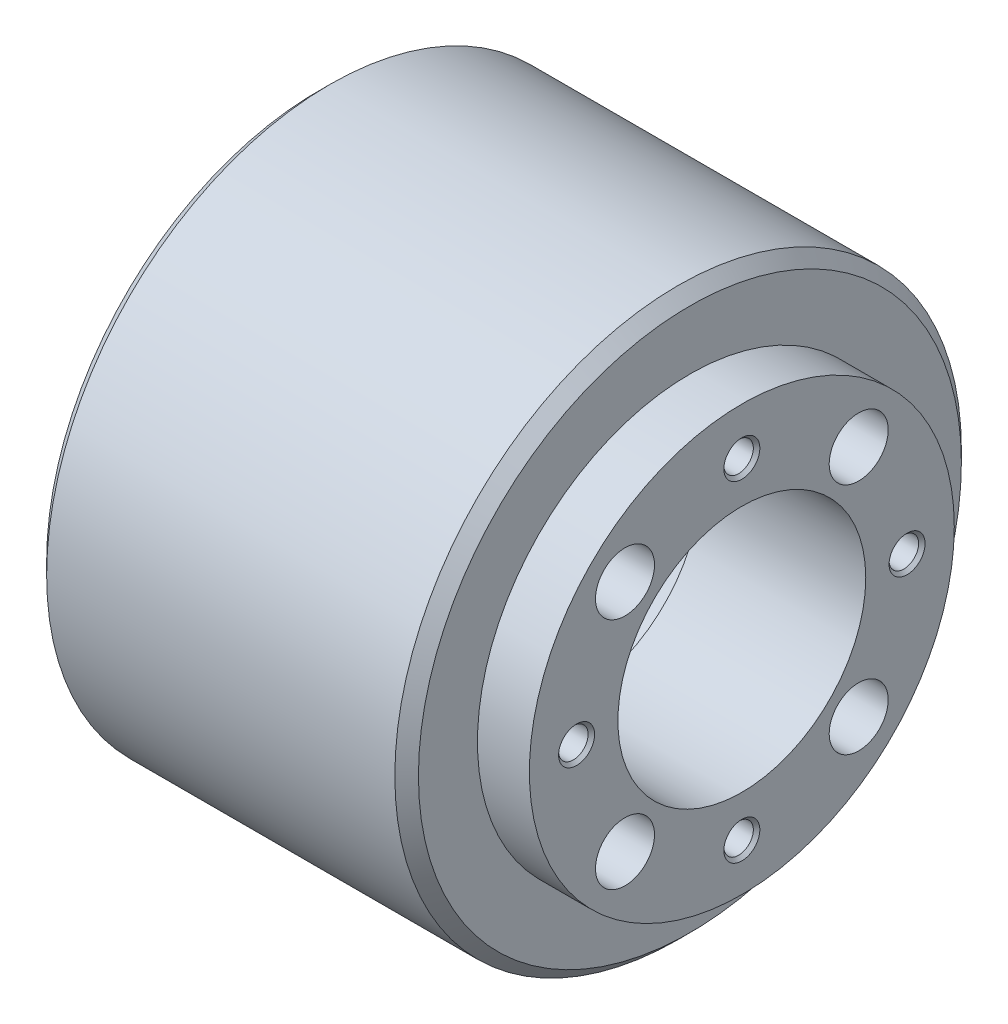
ISO-10303-21;
HEADER;
FILE_DESCRIPTION(('STEP AP214'),'2;1');
FILE_NAME('part.step','',(''),(''),'','','');
FILE_SCHEMA(('AUTOMOTIVE_DESIGN { 1 0 10303 214 1 1 1 1 }'));
ENDSEC;
DATA;
#1=APPLICATION_CONTEXT('core data for automotive mechanical design processes');
#2=APPLICATION_PROTOCOL_DEFINITION('international standard','automotive_design',2000,#1);
#3=PRODUCT_CONTEXT('',#1,'mechanical');
#4=PRODUCT('Part','Part','',(#3));
#5=PRODUCT_RELATED_PRODUCT_CATEGORY('part','',(#4));
#6=PRODUCT_DEFINITION_FORMATION('','',#4);
#7=PRODUCT_DEFINITION_CONTEXT('part definition',#1,'design');
#8=PRODUCT_DEFINITION('design','',#6,#7);
#9=PRODUCT_DEFINITION_SHAPE('','',#8);
#10=(LENGTH_UNIT() NAMED_UNIT(*) SI_UNIT(.MILLI.,.METRE.));
#11=(NAMED_UNIT(*) PLANE_ANGLE_UNIT() SI_UNIT($,.RADIAN.));
#12=(NAMED_UNIT(*) SI_UNIT($,.STERADIAN.) SOLID_ANGLE_UNIT());
#13=UNCERTAINTY_MEASURE_WITH_UNIT(LENGTH_MEASURE(1.E-05),#10,'distance_accuracy_value','');
#14=(GEOMETRIC_REPRESENTATION_CONTEXT(3) GLOBAL_UNCERTAINTY_ASSIGNED_CONTEXT((#13)) GLOBAL_UNIT_ASSIGNED_CONTEXT((#10,
#11,#12)) REPRESENTATION_CONTEXT('',''));
#15=CARTESIAN_POINT('',(0.,0.,0.));
#16=DIRECTION('',(0.,0.,1.));
#17=DIRECTION('',(1.,0.,0.));
#18=AXIS2_PLACEMENT_3D('',#15,#16,#17);
#19=CARTESIAN_POINT('',(0.,0.,19.5));
#20=DIRECTION('',(1.,0.,0.));
#21=DIRECTION('',(0.,0.,1.));
#22=AXIS2_PLACEMENT_3D('',#19,#20,#21);
#23=PLANE('',#22);
#24=CARTESIAN_POINT('',(0.,0.,0.));
#25=DIRECTION('',(-1.,0.,0.));
#26=DIRECTION('',(0.,0.,1.));
#27=AXIS2_PLACEMENT_3D('',#24,#25,#26);
#28=CIRCLE('',#27,20.5);
#29=CARTESIAN_POINT('',(0.,0.,20.5));
#30=VERTEX_POINT('',#29);
#31=EDGE_CURVE('E135',#30,#30,#28,.T.);
#32=ORIENTED_EDGE('',*,*,#31,.F.);
#33=EDGE_LOOP('',(#32));
#34=FACE_BOUND('',#33,.T.);
#35=CARTESIAN_POINT('',(0.,0.,0.));
#36=DIRECTION('',(-1.,0.,0.));
#37=DIRECTION('',(0.,0.,1.));
#38=AXIS2_PLACEMENT_3D('',#35,#36,#37);
#39=CIRCLE('',#38,23.);
#40=CARTESIAN_POINT('',(0.,0.,23.));
#41=VERTEX_POINT('',#40);
#42=EDGE_CURVE('E132',#41,#41,#39,.F.);
#43=ORIENTED_EDGE('',*,*,#42,.F.);
#44=EDGE_LOOP('',(#43));
#45=FACE_BOUND('',#44,.T.);
#46=ADVANCED_FACE('F37',(#34,#45),#23,.F.);
#47=CARTESIAN_POINT('',(0.,0.,0.));
#48=DIRECTION('',(-1.,0.,0.));
#49=DIRECTION('',(0.,0.,-1.));
#50=AXIS2_PLACEMENT_3D('',#47,#48,#49);
#51=CYLINDRICAL_SURFACE('',#50,24.);
#52=CARTESIAN_POINT('',(30.5,0.,0.));
#53=DIRECTION('',(1.,0.,0.));
#54=DIRECTION('',(0.,0.,-1.));
#55=AXIS2_PLACEMENT_3D('',#52,#53,#54);
#56=CIRCLE('',#55,24.);
#57=CARTESIAN_POINT('',(30.5,0.,-24.));
#58=VERTEX_POINT('',#57);
#59=EDGE_CURVE('E45',#58,#58,#56,.T.);
#60=ORIENTED_EDGE('',*,*,#59,.F.);
#61=EDGE_LOOP('',(#60));
#62=FACE_BOUND('',#61,.T.);
#63=CARTESIAN_POINT('',(0.99999999999999,0.,0.));
#64=DIRECTION('',(-1.,0.,0.));
#65=DIRECTION('',(0.,0.,1.));
#66=AXIS2_PLACEMENT_3D('',#63,#64,#65);
#67=CIRCLE('',#66,24.);
#68=CARTESIAN_POINT('',(0.99999999999999,0.,24.));
#69=VERTEX_POINT('',#68);
#70=EDGE_CURVE('E138',#69,#69,#67,.T.);
#71=ORIENTED_EDGE('',*,*,#70,.F.);
#72=EDGE_LOOP('',(#71));
#73=FACE_BOUND('',#72,.T.);
#74=ADVANCED_FACE('F145',(#62,#73),#51,.T.);
#75=CARTESIAN_POINT('',(31.5,0.,24.));
#76=DIRECTION('',(-1.,0.,0.));
#77=DIRECTION('',(0.,0.,-1.));
#78=AXIS2_PLACEMENT_3D('',#75,#76,#77);
#79=PLANE('',#78);
#80=CARTESIAN_POINT('',(31.5,0.,0.));
#81=DIRECTION('',(1.,0.,0.));
#82=DIRECTION('',(0.,0.,-1.));
#83=AXIS2_PLACEMENT_3D('',#80,#81,#82);
#84=CIRCLE('',#83,23.);
#85=CARTESIAN_POINT('',(31.5,0.,-23.));
#86=VERTEX_POINT('',#85);
#87=EDGE_CURVE('E11',#86,#86,#84,.F.);
#88=ORIENTED_EDGE('',*,*,#87,.F.);
#89=EDGE_LOOP('',(#88));
#90=FACE_BOUND('',#89,.T.);
#91=CARTESIAN_POINT('',(31.5,0.,0.));
#92=DIRECTION('',(1.,0.,0.));
#93=DIRECTION('',(0.,0.,-1.));
#94=AXIS2_PLACEMENT_3D('',#91,#92,#93);
#95=CIRCLE('',#94,18.);
#96=CARTESIAN_POINT('',(31.5,0.,-18.));
#97=VERTEX_POINT('',#96);
#98=EDGE_CURVE('E114',#97,#97,#95,.T.);
#99=ORIENTED_EDGE('',*,*,#98,.F.);
#100=EDGE_LOOP('',(#99));
#101=FACE_BOUND('',#100,.T.);
#102=ADVANCED_FACE('F148',(#90,#101),#79,.F.);
#103=CARTESIAN_POINT('',(0.,0.,0.));
#104=DIRECTION('',(-1.,0.,0.));
#105=DIRECTION('',(0.,0.,-1.));
#106=AXIS2_PLACEMENT_3D('',#103,#104,#105);
#107=CYLINDRICAL_SURFACE('',#106,18.);
#108=ORIENTED_EDGE('',*,*,#98,.T.);
#109=EDGE_LOOP('',(#108));
#110=FACE_BOUND('',#109,.T.);
#111=CARTESIAN_POINT('',(35.9,0.,0.));
#112=DIRECTION('',(1.,0.,0.));
#113=DIRECTION('',(0.,0.,-1.));
#114=AXIS2_PLACEMENT_3D('',#111,#112,#113);
#115=CIRCLE('',#114,18.);
#116=CARTESIAN_POINT('',(35.9,0.,-18.));
#117=VERTEX_POINT('',#116);
#118=EDGE_CURVE('E111',#117,#117,#115,.T.);
#119=ORIENTED_EDGE('',*,*,#118,.F.);
#120=EDGE_LOOP('',(#119));
#121=FACE_BOUND('',#120,.T.);
#122=ADVANCED_FACE('F185',(#110,#121),#107,.T.);
#123=CARTESIAN_POINT('',(35.9,0.,10.5));
#124=DIRECTION('',(-1.,0.,0.));
#125=DIRECTION('',(0.,0.,-1.));
#126=AXIS2_PLACEMENT_3D('',#123,#124,#125);
#127=PLANE('',#126);
#128=CARTESIAN_POINT('',(35.9,-9.89949493661167,9.89949493661166));
#129=DIRECTION('',(-1.,0.,0.));
#130=DIRECTION('',(0.,0.,-1.));
#131=AXIS2_PLACEMENT_3D('',#128,#129,#130);
#132=CIRCLE('',#131,2.5);
#133=CARTESIAN_POINT('',(35.9,-9.89949493661167,7.39949493661166));
#134=VERTEX_POINT('',#133);
#135=EDGE_CURVE('E302',#134,#134,#132,.T.);
#136=ORIENTED_EDGE('',*,*,#135,.T.);
#137=EDGE_LOOP('',(#136));
#138=FACE_BOUND('',#137,.T.);
#139=CARTESIAN_POINT('',(35.9,-9.89949493661167,-9.89949493661166));
#140=DIRECTION('',(-1.,0.,0.));
#141=DIRECTION('',(0.,0.,1.));
#142=AXIS2_PLACEMENT_3D('',#139,#140,#141);
#143=CIRCLE('',#142,2.5);
#144=CARTESIAN_POINT('',(35.9,-9.89949493661167,-7.39949493661166));
#145=VERTEX_POINT('',#144);
#146=EDGE_CURVE('E301',#145,#145,#143,.T.);
#147=ORIENTED_EDGE('',*,*,#146,.T.);
#148=EDGE_LOOP('',(#147));
#149=FACE_BOUND('',#148,.T.);
#150=CARTESIAN_POINT('',(35.9,9.89949493661167,9.89949493661167));
#151=DIRECTION('',(-1.,0.,0.));
#152=DIRECTION('',(0.,0.,-1.));
#153=AXIS2_PLACEMENT_3D('',#150,#151,#152);
#154=CIRCLE('',#153,2.5);
#155=CARTESIAN_POINT('',(35.9,9.89949493661167,7.39949493661166));
#156=VERTEX_POINT('',#155);
#157=EDGE_CURVE('E311',#156,#156,#154,.T.);
#158=ORIENTED_EDGE('',*,*,#157,.T.);
#159=EDGE_LOOP('',(#158));
#160=FACE_BOUND('',#159,.T.);
#161=CARTESIAN_POINT('',(35.9,9.89949493661167,-9.89949493661167));
#162=DIRECTION('',(-1.,0.,0.));
#163=DIRECTION('',(0.,0.,1.));
#164=AXIS2_PLACEMENT_3D('',#161,#162,#163);
#165=CIRCLE('',#164,2.5);
#166=CARTESIAN_POINT('',(35.9,9.89949493661167,-7.39949493661166));
#167=VERTEX_POINT('',#166);
#168=EDGE_CURVE('E316',#167,#167,#165,.T.);
#169=ORIENTED_EDGE('',*,*,#168,.T.);
#170=EDGE_LOOP('',(#169));
#171=FACE_BOUND('',#170,.T.);
#172=CARTESIAN_POINT('',(35.9,14.,0.));
#173=DIRECTION('',(-1.,0.,0.));
#174=DIRECTION('',(0.,0.,1.));
#175=AXIS2_PLACEMENT_3D('',#172,#173,#174);
#176=CIRCLE('',#175,1.525);
#177=CARTESIAN_POINT('',(35.9,14.,1.525));
#178=VERTEX_POINT('',#177);
#179=EDGE_CURVE('E75',#178,#178,#176,.T.);
#180=ORIENTED_EDGE('',*,*,#179,.T.);
#181=EDGE_LOOP('',(#180));
#182=FACE_BOUND('',#181,.T.);
#183=CARTESIAN_POINT('',(35.9,0.,14.));
#184=DIRECTION('',(-1.,0.,0.));
#185=DIRECTION('',(0.,0.,1.));
#186=AXIS2_PLACEMENT_3D('',#183,#184,#185);
#187=CIRCLE('',#186,1.525);
#188=CARTESIAN_POINT('',(35.9,0.,15.525));
#189=VERTEX_POINT('',#188);
#190=EDGE_CURVE('E68',#189,#189,#187,.T.);
#191=ORIENTED_EDGE('',*,*,#190,.T.);
#192=EDGE_LOOP('',(#191));
#193=FACE_BOUND('',#192,.T.);
#194=CARTESIAN_POINT('',(35.9,-14.,0.));
#195=DIRECTION('',(-1.,0.,0.));
#196=DIRECTION('',(0.,0.,1.));
#197=AXIS2_PLACEMENT_3D('',#194,#195,#196);
#198=CIRCLE('',#197,1.525);
#199=CARTESIAN_POINT('',(35.9,-14.,1.525));
#200=VERTEX_POINT('',#199);
#201=EDGE_CURVE('E84',#200,#200,#198,.T.);
#202=ORIENTED_EDGE('',*,*,#201,.T.);
#203=EDGE_LOOP('',(#202));
#204=FACE_BOUND('',#203,.T.);
#205=CARTESIAN_POINT('',(35.9,0.,-14.));
#206=DIRECTION('',(-1.,0.,0.));
#207=DIRECTION('',(0.,0.,1.));
#208=AXIS2_PLACEMENT_3D('',#205,#206,#207);
#209=CIRCLE('',#208,1.525);
#210=CARTESIAN_POINT('',(35.9,0.,-12.475));
#211=VERTEX_POINT('',#210);
#212=EDGE_CURVE('E93',#211,#211,#209,.T.);
#213=ORIENTED_EDGE('',*,*,#212,.T.);
#214=EDGE_LOOP('',(#213));
#215=FACE_BOUND('',#214,.T.);
#216=ORIENTED_EDGE('',*,*,#118,.T.);
#217=EDGE_LOOP('',(#216));
#218=FACE_BOUND('',#217,.T.);
#219=CARTESIAN_POINT('',(35.9,0.,0.));
#220=DIRECTION('',(1.,0.,0.));
#221=DIRECTION('',(0.,0.,-1.));
#222=AXIS2_PLACEMENT_3D('',#219,#220,#221);
#223=CIRCLE('',#222,10.5);
#224=CARTESIAN_POINT('',(35.9,0.,-10.5));
#225=VERTEX_POINT('',#224);
#226=EDGE_CURVE('E108',#225,#225,#223,.T.);
#227=ORIENTED_EDGE('',*,*,#226,.F.);
#228=EDGE_LOOP('',(#227));
#229=FACE_BOUND('',#228,.T.);
#230=ADVANCED_FACE('F190',(#138,#149,#160,#171,#182,#193,#204,#215,#218,#229),#127,.F.);
#231=CARTESIAN_POINT('',(0.,0.,0.));
#232=DIRECTION('',(-1.,0.,0.));
#233=DIRECTION('',(0.,0.,-1.));
#234=AXIS2_PLACEMENT_3D('',#231,#232,#233);
#235=CYLINDRICAL_SURFACE('',#234,10.5);
#236=ORIENTED_EDGE('',*,*,#226,.T.);
#237=EDGE_LOOP('',(#236));
#238=FACE_BOUND('',#237,.T.);
#239=CARTESIAN_POINT('',(21.9,0.,0.));
#240=DIRECTION('',(1.,0.,0.));
#241=DIRECTION('',(0.,0.,-1.));
#242=AXIS2_PLACEMENT_3D('',#239,#240,#241);
#243=CIRCLE('',#242,10.5);
#244=CARTESIAN_POINT('',(21.9,0.,-10.5));
#245=VERTEX_POINT('',#244);
#246=EDGE_CURVE('E105',#245,#245,#243,.T.);
#247=ORIENTED_EDGE('',*,*,#246,.F.);
#248=EDGE_LOOP('',(#247));
#249=FACE_BOUND('',#248,.T.);
#250=ADVANCED_FACE('F196',(#238,#249),#235,.F.);
#251=CARTESIAN_POINT('',(21.9,0.,15.));
#252=DIRECTION('',(1.,0.,0.));
#253=DIRECTION('',(0.,0.,1.));
#254=AXIS2_PLACEMENT_3D('',#251,#252,#253);
#255=PLANE('',#254);
#256=ORIENTED_EDGE('',*,*,#246,.T.);
#257=EDGE_LOOP('',(#256));
#258=FACE_BOUND('',#257,.T.);
#259=CARTESIAN_POINT('',(21.9,0.,0.));
#260=DIRECTION('',(1.,0.,0.));
#261=DIRECTION('',(0.,0.,-1.));
#262=AXIS2_PLACEMENT_3D('',#259,#260,#261);
#263=CIRCLE('',#262,15.);
#264=CARTESIAN_POINT('',(21.9,0.,-15.));
#265=VERTEX_POINT('',#264);
#266=EDGE_CURVE('E102',#265,#265,#263,.T.);
#267=ORIENTED_EDGE('',*,*,#266,.F.);
#268=EDGE_LOOP('',(#267));
#269=FACE_BOUND('',#268,.T.);
#270=ADVANCED_FACE('F203',(#258,#269),#255,.F.);
#271=CARTESIAN_POINT('',(0.,0.,0.));
#272=DIRECTION('',(-1.,0.,0.));
#273=DIRECTION('',(0.,0.,-1.));
#274=AXIS2_PLACEMENT_3D('',#271,#272,#273);
#275=CYLINDRICAL_SURFACE('',#274,15.);
#276=CARTESIAN_POINT('',(6.39999999999999,0.,0.));
#277=DIRECTION('',(-1.,0.,0.));
#278=DIRECTION('',(0.,0.,1.));
#279=AXIS2_PLACEMENT_3D('',#276,#277,#278);
#280=CIRCLE('',#279,15.);
#281=CARTESIAN_POINT('',(6.39999999999999,0.,15.));
#282=VERTEX_POINT('',#281);
#283=EDGE_CURVE('E129',#282,#282,#280,.F.);
#284=ORIENTED_EDGE('',*,*,#283,.F.);
#285=EDGE_LOOP('',(#284));
#286=FACE_BOUND('',#285,.T.);
#287=ORIENTED_EDGE('',*,*,#266,.T.);
#288=EDGE_LOOP('',(#287));
#289=FACE_BOUND('',#288,.T.);
#290=ADVANCED_FACE('F209',(#286,#289),#275,.F.);
#291=CARTESIAN_POINT('',(5.4,0.,15.));
#292=DIRECTION('',(1.,0.,0.));
#293=DIRECTION('',(0.,0.,1.));
#294=AXIS2_PLACEMENT_3D('',#291,#292,#293);
#295=PLANE('',#294);
#296=CARTESIAN_POINT('',(5.4,0.,0.));
#297=DIRECTION('',(-1.,0.,0.));
#298=DIRECTION('',(0.,0.,1.));
#299=AXIS2_PLACEMENT_3D('',#296,#297,#298);
#300=CIRCLE('',#299,18.5);
#301=CARTESIAN_POINT('',(5.4,0.,18.5));
#302=VERTEX_POINT('',#301);
#303=EDGE_CURVE('E120',#302,#302,#300,.F.);
#304=ORIENTED_EDGE('',*,*,#303,.F.);
#305=EDGE_LOOP('',(#304));
#306=FACE_BOUND('',#305,.T.);
#307=CARTESIAN_POINT('',(5.4,0.,0.));
#308=DIRECTION('',(-1.,0.,0.));
#309=DIRECTION('',(0.,0.,1.));
#310=AXIS2_PLACEMENT_3D('',#307,#308,#309);
#311=CIRCLE('',#310,16.);
#312=CARTESIAN_POINT('',(5.4,0.,16.));
#313=VERTEX_POINT('',#312);
#314=EDGE_CURVE('E117',#313,#313,#311,.T.);
#315=ORIENTED_EDGE('',*,*,#314,.F.);
#316=EDGE_LOOP('',(#315));
#317=FACE_BOUND('',#316,.T.);
#318=ADVANCED_FACE('F214',(#306,#317),#295,.F.);
#319=CARTESIAN_POINT('',(0.,0.,0.));
#320=DIRECTION('',(-1.,0.,0.));
#321=DIRECTION('',(0.,0.,-1.));
#322=AXIS2_PLACEMENT_3D('',#319,#320,#321);
#323=CYLINDRICAL_SURFACE('',#322,19.5);
#324=CARTESIAN_POINT('',(4.4,0.,0.));
#325=DIRECTION('',(-1.,0.,0.));
#326=DIRECTION('',(0.,0.,1.));
#327=AXIS2_PLACEMENT_3D('',#324,#325,#326);
#328=CIRCLE('',#327,19.5);
#329=CARTESIAN_POINT('',(4.4,0.,19.5));
#330=VERTEX_POINT('',#329);
#331=EDGE_CURVE('E126',#330,#330,#328,.T.);
#332=ORIENTED_EDGE('',*,*,#331,.F.);
#333=EDGE_LOOP('',(#332));
#334=FACE_BOUND('',#333,.T.);
#335=CARTESIAN_POINT('',(1.00000000000002,0.,0.));
#336=DIRECTION('',(-1.,0.,0.));
#337=DIRECTION('',(0.,0.,1.));
#338=AXIS2_PLACEMENT_3D('',#335,#336,#337);
#339=CIRCLE('',#338,19.5);
#340=CARTESIAN_POINT('',(1.00000000000002,0.,19.5));
#341=VERTEX_POINT('',#340);
#342=EDGE_CURVE('E123',#341,#341,#339,.F.);
#343=ORIENTED_EDGE('',*,*,#342,.F.);
#344=EDGE_LOOP('',(#343));
#345=FACE_BOUND('',#344,.T.);
#346=ADVANCED_FACE('F169',(#334,#345),#323,.F.);
#347=CARTESIAN_POINT('',(5.4,0.,0.));
#348=DIRECTION('',(-1.,0.,0.));
#349=DIRECTION('',(0.,0.,-1.));
#350=AXIS2_PLACEMENT_3D('',#347,#348,#349);
#351=CONICAL_SURFACE('',#350,18.5,0.785398163397454);
#352=ORIENTED_EDGE('',*,*,#331,.T.);
#353=EDGE_LOOP('',(#352));
#354=FACE_BOUND('',#353,.T.);
#355=ORIENTED_EDGE('',*,*,#303,.T.);
#356=EDGE_LOOP('',(#355));
#357=FACE_BOUND('',#356,.T.);
#358=ADVANCED_FACE('F165',(#354,#357),#351,.F.);
#359=CARTESIAN_POINT('',(6.39999999999999,0.,0.));
#360=DIRECTION('',(-1.,0.,0.));
#361=DIRECTION('',(0.,0.,-1.));
#362=AXIS2_PLACEMENT_3D('',#359,#360,#361);
#363=CONICAL_SURFACE('',#362,15.,0.785398163397453);
#364=ORIENTED_EDGE('',*,*,#314,.T.);
#365=EDGE_LOOP('',(#364));
#366=FACE_BOUND('',#365,.T.);
#367=ORIENTED_EDGE('',*,*,#283,.T.);
#368=EDGE_LOOP('',(#367));
#369=FACE_BOUND('',#368,.T.);
#370=ADVANCED_FACE('F168',(#366,#369),#363,.F.);
#371=CARTESIAN_POINT('',(1.00000000000002,0.,0.));
#372=DIRECTION('',(-1.,0.,0.));
#373=DIRECTION('',(0.,0.,-1.));
#374=AXIS2_PLACEMENT_3D('',#371,#372,#373);
#375=CONICAL_SURFACE('',#374,19.5,0.785398163397447);
#376=ORIENTED_EDGE('',*,*,#31,.T.);
#377=EDGE_LOOP('',(#376));
#378=FACE_BOUND('',#377,.T.);
#379=ORIENTED_EDGE('',*,*,#342,.T.);
#380=EDGE_LOOP('',(#379));
#381=FACE_BOUND('',#380,.T.);
#382=ADVANCED_FACE('F173',(#378,#381),#375,.F.);
#383=CARTESIAN_POINT('',(30.5,0.,0.));
#384=DIRECTION('',(-1.,0.,0.));
#385=DIRECTION('',(0.,0.,-1.));
#386=AXIS2_PLACEMENT_3D('',#383,#384,#385);
#387=CONICAL_SURFACE('',#386,24.,0.785398163397453);
#388=ORIENTED_EDGE('',*,*,#87,.T.);
#389=EDGE_LOOP('',(#388));
#390=FACE_BOUND('',#389,.T.);
#391=ORIENTED_EDGE('',*,*,#59,.T.);
#392=EDGE_LOOP('',(#391));
#393=FACE_BOUND('',#392,.T.);
#394=ADVANCED_FACE('F143',(#390,#393),#387,.T.);
#395=CARTESIAN_POINT('',(0.,0.,0.));
#396=DIRECTION('',(1.,0.,0.));
#397=DIRECTION('',(0.,0.,1.));
#398=AXIS2_PLACEMENT_3D('',#395,#396,#397);
#399=CONICAL_SURFACE('',#398,23.,0.785398163397445);
#400=ORIENTED_EDGE('',*,*,#70,.T.);
#401=EDGE_LOOP('',(#400));
#402=FACE_BOUND('',#401,.T.);
#403=ORIENTED_EDGE('',*,*,#42,.T.);
#404=EDGE_LOOP('',(#403));
#405=FACE_BOUND('',#404,.T.);
#406=ADVANCED_FACE('F39',(#402,#405),#399,.T.);
#407=CARTESIAN_POINT('',(24.9,0.,-14.));
#408=DIRECTION('',(1.,0.,0.));
#409=DIRECTION('',(0.,0.,1.));
#410=AXIS2_PLACEMENT_3D('',#407,#408,#409);
#411=CONICAL_SURFACE('',#410,1.25,1.02974425867665);
#412=CARTESIAN_POINT('',(24.1489242262156,0.,-14.));
#413=VERTEX_POINT('',#412);
#414=VERTEX_LOOP('',#413);
#415=FACE_BOUND('',#414,.T.);
#416=CARTESIAN_POINT('',(24.9,0.,-14.));
#417=DIRECTION('',(-1.,0.,0.));
#418=DIRECTION('',(0.,0.,1.));
#419=AXIS2_PLACEMENT_3D('',#416,#417,#418);
#420=CIRCLE('',#419,1.25);
#421=CARTESIAN_POINT('',(24.9,0.,-12.75));
#422=VERTEX_POINT('',#421);
#423=EDGE_CURVE('E99',#422,#422,#420,.T.);
#424=ORIENTED_EDGE('',*,*,#423,.F.);
#425=EDGE_LOOP('',(#424));
#426=FACE_BOUND('',#425,.T.);
#427=ADVANCED_FACE('F154',(#415,#426),#411,.F.);
#428=CARTESIAN_POINT('',(35.9,0.,-14.));
#429=DIRECTION('',(1.,0.,0.));
#430=DIRECTION('',(0.,0.,1.));
#431=AXIS2_PLACEMENT_3D('',#428,#429,#430);
#432=CYLINDRICAL_SURFACE('',#431,1.25);
#433=ORIENTED_EDGE('',*,*,#423,.T.);
#434=EDGE_LOOP('',(#433));
#435=FACE_BOUND('',#434,.T.);
#436=CARTESIAN_POINT('',(35.625,0.,-14.));
#437=DIRECTION('',(-1.,0.,0.));
#438=DIRECTION('',(0.,0.,1.));
#439=AXIS2_PLACEMENT_3D('',#436,#437,#438);
#440=CIRCLE('',#439,1.25);
#441=CARTESIAN_POINT('',(35.625,0.,-12.75));
#442=VERTEX_POINT('',#441);
#443=EDGE_CURVE('E96',#442,#442,#440,.T.);
#444=ORIENTED_EDGE('',*,*,#443,.F.);
#445=EDGE_LOOP('',(#444));
#446=FACE_BOUND('',#445,.T.);
#447=ADVANCED_FACE('F229',(#435,#446),#432,.F.);
#448=CARTESIAN_POINT('',(35.9,0.,-14.));
#449=DIRECTION('',(1.,0.,0.));
#450=DIRECTION('',(0.,0.,1.));
#451=AXIS2_PLACEMENT_3D('',#448,#449,#450);
#452=CONICAL_SURFACE('',#451,1.525,0.785398163397442);
#453=ORIENTED_EDGE('',*,*,#443,.T.);
#454=EDGE_LOOP('',(#453));
#455=FACE_BOUND('',#454,.T.);
#456=ORIENTED_EDGE('',*,*,#212,.F.);
#457=EDGE_LOOP('',(#456));
#458=FACE_BOUND('',#457,.T.);
#459=ADVANCED_FACE('F232',(#455,#458),#452,.F.);
#460=CARTESIAN_POINT('',(24.9,-14.,0.));
#461=DIRECTION('',(1.,0.,0.));
#462=DIRECTION('',(0.,0.,1.));
#463=AXIS2_PLACEMENT_3D('',#460,#461,#462);
#464=CONICAL_SURFACE('',#463,1.25,1.02974425867665);
#465=CARTESIAN_POINT('',(24.1489242262156,-14.,0.));
#466=VERTEX_POINT('',#465);
#467=VERTEX_LOOP('',#466);
#468=FACE_BOUND('',#467,.T.);
#469=CARTESIAN_POINT('',(24.9,-14.,0.));
#470=DIRECTION('',(-1.,0.,0.));
#471=DIRECTION('',(0.,0.,1.));
#472=AXIS2_PLACEMENT_3D('',#469,#470,#471);
#473=CIRCLE('',#472,1.25);
#474=CARTESIAN_POINT('',(24.9,-14.,1.25));
#475=VERTEX_POINT('',#474);
#476=EDGE_CURVE('E90',#475,#475,#473,.T.);
#477=ORIENTED_EDGE('',*,*,#476,.F.);
#478=EDGE_LOOP('',(#477));
#479=FACE_BOUND('',#478,.T.);
#480=ADVANCED_FACE('F236',(#468,#479),#464,.F.);
#481=CARTESIAN_POINT('',(35.9,-14.,0.));
#482=DIRECTION('',(1.,0.,0.));
#483=DIRECTION('',(0.,0.,1.));
#484=AXIS2_PLACEMENT_3D('',#481,#482,#483);
#485=CYLINDRICAL_SURFACE('',#484,1.25);
#486=ORIENTED_EDGE('',*,*,#476,.T.);
#487=EDGE_LOOP('',(#486));
#488=FACE_BOUND('',#487,.T.);
#489=CARTESIAN_POINT('',(35.625,-14.,0.));
#490=DIRECTION('',(-1.,0.,0.));
#491=DIRECTION('',(0.,0.,1.));
#492=AXIS2_PLACEMENT_3D('',#489,#490,#491);
#493=CIRCLE('',#492,1.25);
#494=CARTESIAN_POINT('',(35.625,-14.,1.25));
#495=VERTEX_POINT('',#494);
#496=EDGE_CURVE('E87',#495,#495,#493,.T.);
#497=ORIENTED_EDGE('',*,*,#496,.F.);
#498=EDGE_LOOP('',(#497));
#499=FACE_BOUND('',#498,.T.);
#500=ADVANCED_FACE('F240',(#488,#499),#485,.F.);
#501=CARTESIAN_POINT('',(35.9,-14.,0.));
#502=DIRECTION('',(1.,0.,0.));
#503=DIRECTION('',(0.,0.,1.));
#504=AXIS2_PLACEMENT_3D('',#501,#502,#503);
#505=CONICAL_SURFACE('',#504,1.525,0.785398163397442);
#506=ORIENTED_EDGE('',*,*,#496,.T.);
#507=EDGE_LOOP('',(#506));
#508=FACE_BOUND('',#507,.T.);
#509=ORIENTED_EDGE('',*,*,#201,.F.);
#510=EDGE_LOOP('',(#509));
#511=FACE_BOUND('',#510,.T.);
#512=ADVANCED_FACE('F243',(#508,#511),#505,.F.);
#513=CARTESIAN_POINT('',(24.9,0.,14.));
#514=DIRECTION('',(1.,0.,0.));
#515=DIRECTION('',(0.,0.,1.));
#516=AXIS2_PLACEMENT_3D('',#513,#514,#515);
#517=CONICAL_SURFACE('',#516,1.25,1.02974425867665);
#518=CARTESIAN_POINT('',(24.1489242262156,0.,14.));
#519=VERTEX_POINT('',#518);
#520=VERTEX_LOOP('',#519);
#521=FACE_BOUND('',#520,.T.);
#522=CARTESIAN_POINT('',(24.9,0.,14.));
#523=DIRECTION('',(-1.,0.,0.));
#524=DIRECTION('',(0.,0.,1.));
#525=AXIS2_PLACEMENT_3D('',#522,#523,#524);
#526=CIRCLE('',#525,1.25);
#527=CARTESIAN_POINT('',(24.9,0.,15.25));
#528=VERTEX_POINT('',#527);
#529=EDGE_CURVE('E81',#528,#528,#526,.T.);
#530=ORIENTED_EDGE('',*,*,#529,.F.);
#531=EDGE_LOOP('',(#530));
#532=FACE_BOUND('',#531,.T.);
#533=ADVANCED_FACE('F247',(#521,#532),#517,.F.);
#534=CARTESIAN_POINT('',(35.9,0.,14.));
#535=DIRECTION('',(1.,0.,0.));
#536=DIRECTION('',(0.,0.,1.));
#537=AXIS2_PLACEMENT_3D('',#534,#535,#536);
#538=CYLINDRICAL_SURFACE('',#537,1.25);
#539=ORIENTED_EDGE('',*,*,#529,.T.);
#540=EDGE_LOOP('',(#539));
#541=FACE_BOUND('',#540,.T.);
#542=CARTESIAN_POINT('',(35.625,0.,14.));
#543=DIRECTION('',(-1.,0.,0.));
#544=DIRECTION('',(0.,0.,1.));
#545=AXIS2_PLACEMENT_3D('',#542,#543,#544);
#546=CIRCLE('',#545,1.25);
#547=CARTESIAN_POINT('',(35.625,0.,15.25));
#548=VERTEX_POINT('',#547);
#549=EDGE_CURVE('E72',#548,#548,#546,.T.);
#550=ORIENTED_EDGE('',*,*,#549,.F.);
#551=EDGE_LOOP('',(#550));
#552=FACE_BOUND('',#551,.T.);
#553=ADVANCED_FACE('F251',(#541,#552),#538,.F.);
#554=CARTESIAN_POINT('',(35.9,0.,14.));
#555=DIRECTION('',(1.,0.,0.));
#556=DIRECTION('',(0.,0.,1.));
#557=AXIS2_PLACEMENT_3D('',#554,#555,#556);
#558=CONICAL_SURFACE('',#557,1.525,0.785398163397442);
#559=ORIENTED_EDGE('',*,*,#549,.T.);
#560=EDGE_LOOP('',(#559));
#561=FACE_BOUND('',#560,.T.);
#562=ORIENTED_EDGE('',*,*,#190,.F.);
#563=EDGE_LOOP('',(#562));
#564=FACE_BOUND('',#563,.T.);
#565=ADVANCED_FACE('F62',(#561,#564),#558,.F.);
#566=CARTESIAN_POINT('',(24.9,14.,0.));
#567=DIRECTION('',(1.,0.,0.));
#568=DIRECTION('',(0.,0.,1.));
#569=AXIS2_PLACEMENT_3D('',#566,#567,#568);
#570=CONICAL_SURFACE('',#569,1.25,1.02974425867665);
#571=CARTESIAN_POINT('',(24.1489242262156,14.,0.));
#572=VERTEX_POINT('',#571);
#573=VERTEX_LOOP('',#572);
#574=FACE_BOUND('',#573,.T.);
#575=CARTESIAN_POINT('',(24.9,14.,0.));
#576=DIRECTION('',(-1.,0.,0.));
#577=DIRECTION('',(0.,0.,1.));
#578=AXIS2_PLACEMENT_3D('',#575,#576,#577);
#579=CIRCLE('',#578,1.25);
#580=CARTESIAN_POINT('',(24.9,14.,1.25));
#581=VERTEX_POINT('',#580);
#582=EDGE_CURVE('E66',#581,#581,#579,.T.);
#583=ORIENTED_EDGE('',*,*,#582,.F.);
#584=EDGE_LOOP('',(#583));
#585=FACE_BOUND('',#584,.T.);
#586=ADVANCED_FACE('F58',(#574,#585),#570,.F.);
#587=CARTESIAN_POINT('',(35.9,14.,0.));
#588=DIRECTION('',(1.,0.,0.));
#589=DIRECTION('',(0.,0.,1.));
#590=AXIS2_PLACEMENT_3D('',#587,#588,#589);
#591=CYLINDRICAL_SURFACE('',#590,1.25);
#592=ORIENTED_EDGE('',*,*,#582,.T.);
#593=EDGE_LOOP('',(#592));
#594=FACE_BOUND('',#593,.T.);
#595=CARTESIAN_POINT('',(35.625,14.,0.));
#596=DIRECTION('',(-1.,0.,0.));
#597=DIRECTION('',(0.,0.,1.));
#598=AXIS2_PLACEMENT_3D('',#595,#596,#597);
#599=CIRCLE('',#598,1.25);
#600=CARTESIAN_POINT('',(35.625,14.,1.25));
#601=VERTEX_POINT('',#600);
#602=EDGE_CURVE('E69',#601,#601,#599,.T.);
#603=ORIENTED_EDGE('',*,*,#602,.F.);
#604=EDGE_LOOP('',(#603));
#605=FACE_BOUND('',#604,.T.);
#606=ADVANCED_FACE('F61',(#594,#605),#591,.F.);
#607=CARTESIAN_POINT('',(35.9,14.,0.));
#608=DIRECTION('',(1.,0.,0.));
#609=DIRECTION('',(0.,0.,1.));
#610=AXIS2_PLACEMENT_3D('',#607,#608,#609);
#611=CONICAL_SURFACE('',#610,1.525,0.785398163397442);
#612=ORIENTED_EDGE('',*,*,#602,.T.);
#613=EDGE_LOOP('',(#612));
#614=FACE_BOUND('',#613,.T.);
#615=ORIENTED_EDGE('',*,*,#179,.F.);
#616=EDGE_LOOP('',(#615));
#617=FACE_BOUND('',#616,.T.);
#618=ADVANCED_FACE('F261',(#614,#617),#611,.F.);
#619=CARTESIAN_POINT('',(25.9,9.89949493661167,-9.89949493661167));
#620=DIRECTION('',(1.,0.,0.));
#621=DIRECTION('',(0.,0.,1.));
#622=AXIS2_PLACEMENT_3D('',#619,#620,#621);
#623=CYLINDRICAL_SURFACE('',#622,2.5);
#624=CARTESIAN_POINT('',(25.9,9.89949493661167,-9.89949493661167));
#625=DIRECTION('',(-1.,0.,0.));
#626=DIRECTION('',(0.,0.,1.));
#627=AXIS2_PLACEMENT_3D('',#624,#625,#626);
#628=CIRCLE('',#627,2.5);
#629=CARTESIAN_POINT('',(25.9,9.89949493661167,-7.39949493661166));
#630=VERTEX_POINT('',#629);
#631=EDGE_CURVE('E319',#630,#630,#628,.T.);
#632=ORIENTED_EDGE('',*,*,#631,.T.);
#633=EDGE_LOOP('',(#632));
#634=FACE_BOUND('',#633,.T.);
#635=ORIENTED_EDGE('',*,*,#168,.F.);
#636=EDGE_LOOP('',(#635));
#637=FACE_BOUND('',#636,.T.);
#638=ADVANCED_FACE('F264',(#634,#637),#623,.F.);
#639=CARTESIAN_POINT('',(25.9,9.89949493661167,-9.89949493661167));
#640=DIRECTION('',(1.,0.,0.));
#641=DIRECTION('',(0.,0.,1.));
#642=AXIS2_PLACEMENT_3D('',#639,#640,#641);
#643=PLANE('',#642);
#644=ORIENTED_EDGE('',*,*,#631,.F.);
#645=EDGE_LOOP('',(#644));
#646=FACE_BOUND('',#645,.T.);
#647=ADVANCED_FACE('F268',(#646),#643,.T.);
#648=CARTESIAN_POINT('',(25.9,9.89949493661167,9.89949493661167));
#649=DIRECTION('',(1.,0.,0.));
#650=DIRECTION('',(0.,0.,1.));
#651=AXIS2_PLACEMENT_3D('',#648,#649,#650);
#652=CYLINDRICAL_SURFACE('',#651,2.5);
#653=CARTESIAN_POINT('',(25.9,9.89949493661167,9.89949493661167));
#654=DIRECTION('',(-1.,0.,0.));
#655=DIRECTION('',(0.,0.,-1.));
#656=AXIS2_PLACEMENT_3D('',#653,#654,#655);
#657=CIRCLE('',#656,2.5);
#658=CARTESIAN_POINT('',(25.9,9.89949493661167,7.39949493661166));
#659=VERTEX_POINT('',#658);
#660=EDGE_CURVE('E313',#659,#659,#657,.T.);
#661=ORIENTED_EDGE('',*,*,#660,.T.);
#662=EDGE_LOOP('',(#661));
#663=FACE_BOUND('',#662,.T.);
#664=ORIENTED_EDGE('',*,*,#157,.F.);
#665=EDGE_LOOP('',(#664));
#666=FACE_BOUND('',#665,.T.);
#667=ADVANCED_FACE('F272',(#663,#666),#652,.F.);
#668=CARTESIAN_POINT('',(25.9,9.89949493661167,9.89949493661167));
#669=DIRECTION('',(-1.,0.,0.));
#670=DIRECTION('',(0.,0.,-1.));
#671=AXIS2_PLACEMENT_3D('',#668,#669,#670);
#672=PLANE('',#671);
#673=ORIENTED_EDGE('',*,*,#660,.F.);
#674=EDGE_LOOP('',(#673));
#675=FACE_BOUND('',#674,.T.);
#676=ADVANCED_FACE('F276',(#675),#672,.F.);
#677=CARTESIAN_POINT('',(25.9,-9.89949493661167,-9.89949493661166));
#678=DIRECTION('',(1.,0.,0.));
#679=DIRECTION('',(0.,0.,1.));
#680=AXIS2_PLACEMENT_3D('',#677,#678,#679);
#681=CYLINDRICAL_SURFACE('',#680,2.5);
#682=CARTESIAN_POINT('',(25.9,-9.89949493661167,-9.89949493661166));
#683=DIRECTION('',(-1.,0.,0.));
#684=DIRECTION('',(0.,0.,1.));
#685=AXIS2_PLACEMENT_3D('',#682,#683,#684);
#686=CIRCLE('',#685,2.5);
#687=CARTESIAN_POINT('',(25.9,-9.89949493661167,-7.39949493661166));
#688=VERTEX_POINT('',#687);
#689=EDGE_CURVE('E305',#688,#688,#686,.T.);
#690=ORIENTED_EDGE('',*,*,#689,.T.);
#691=EDGE_LOOP('',(#690));
#692=FACE_BOUND('',#691,.T.);
#693=ORIENTED_EDGE('',*,*,#146,.F.);
#694=EDGE_LOOP('',(#693));
#695=FACE_BOUND('',#694,.T.);
#696=ADVANCED_FACE('F280',(#692,#695),#681,.F.);
#697=CARTESIAN_POINT('',(25.9,-9.89949493661167,-9.89949493661166));
#698=DIRECTION('',(1.,0.,0.));
#699=DIRECTION('',(0.,0.,1.));
#700=AXIS2_PLACEMENT_3D('',#697,#698,#699);
#701=PLANE('',#700);
#702=ORIENTED_EDGE('',*,*,#689,.F.);
#703=EDGE_LOOP('',(#702));
#704=FACE_BOUND('',#703,.T.);
#705=ADVANCED_FACE('F284',(#704),#701,.T.);
#706=CARTESIAN_POINT('',(25.9,-9.89949493661167,9.89949493661166));
#707=DIRECTION('',(1.,0.,0.));
#708=DIRECTION('',(0.,0.,1.));
#709=AXIS2_PLACEMENT_3D('',#706,#707,#708);
#710=CYLINDRICAL_SURFACE('',#709,2.5);
#711=CARTESIAN_POINT('',(25.9,-9.89949493661167,9.89949493661166));
#712=DIRECTION('',(-1.,0.,0.));
#713=DIRECTION('',(0.,0.,-1.));
#714=AXIS2_PLACEMENT_3D('',#711,#712,#713);
#715=CIRCLE('',#714,2.5);
#716=CARTESIAN_POINT('',(25.9,-9.89949493661167,7.39949493661166));
#717=VERTEX_POINT('',#716);
#718=EDGE_CURVE('E300',#717,#717,#715,.T.);
#719=ORIENTED_EDGE('',*,*,#718,.T.);
#720=EDGE_LOOP('',(#719));
#721=FACE_BOUND('',#720,.T.);
#722=ORIENTED_EDGE('',*,*,#135,.F.);
#723=EDGE_LOOP('',(#722));
#724=FACE_BOUND('',#723,.T.);
#725=ADVANCED_FACE('F288',(#721,#724),#710,.F.);
#726=CARTESIAN_POINT('',(25.9,-9.89949493661167,9.89949493661166));
#727=DIRECTION('',(-1.,0.,0.));
#728=DIRECTION('',(0.,0.,-1.));
#729=AXIS2_PLACEMENT_3D('',#726,#727,#728);
#730=PLANE('',#729);
#731=ORIENTED_EDGE('',*,*,#718,.F.);
#732=EDGE_LOOP('',(#731));
#733=FACE_BOUND('',#732,.T.);
#734=ADVANCED_FACE('F292',(#733),#730,.F.);
#735=CLOSED_SHELL('',(#46,#74,#102,#122,#230,#250,#270,#290,#318,#346,#358,#370,#382,#394,#406,
#427,#447,#459,#480,#500,#512,#533,#553,#565,#586,#606,#618,#638,#647,#667,#676,#696,#705,#725,#734));
#736=MANIFOLD_SOLID_BREP('B2',#735);
#737=ADVANCED_BREP_SHAPE_REPRESENTATION('',(#18,#736),#14);
#738=SHAPE_DEFINITION_REPRESENTATION(#9,#737);
ENDSEC;
END-ISO-10303-21;
